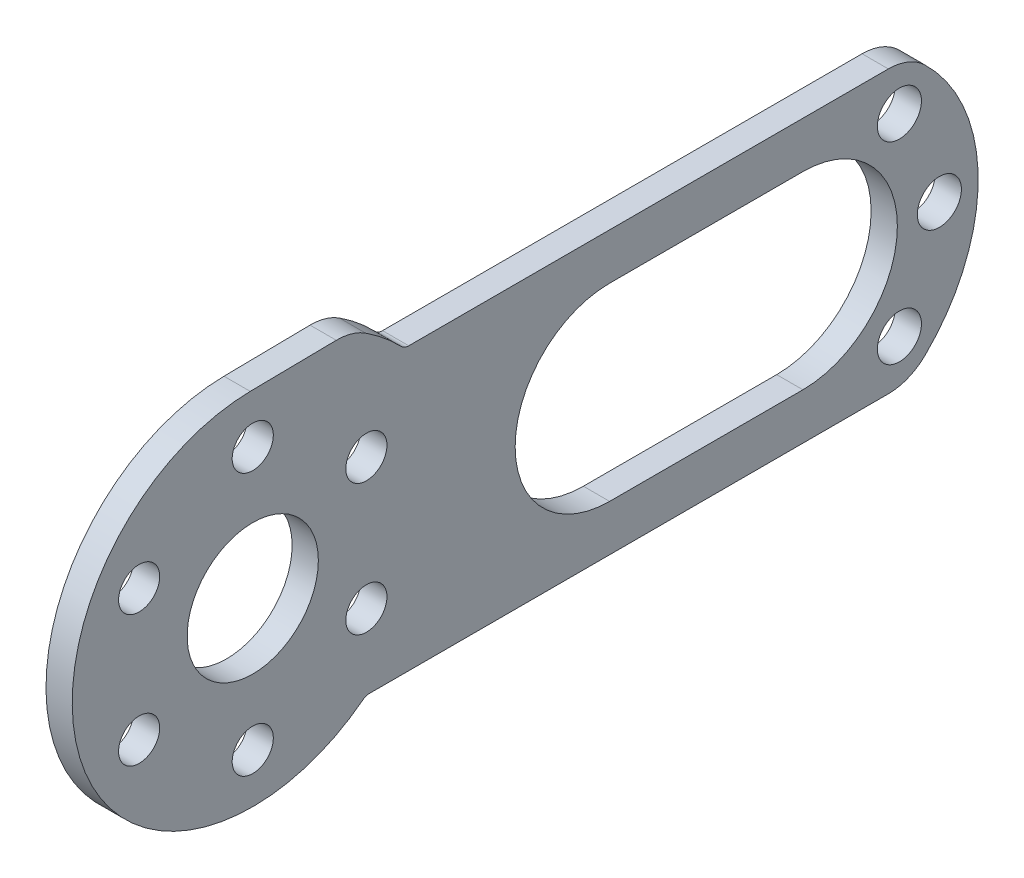
ISO-10303-21;
HEADER;
FILE_DESCRIPTION(('STEP AP214'),'2;1');
FILE_NAME('part.step','',(''),(''),'','','');
FILE_SCHEMA(('AUTOMOTIVE_DESIGN { 1 0 10303 214 1 1 1 1 }'));
ENDSEC;
DATA;
#1=APPLICATION_CONTEXT('core data for automotive mechanical design processes');
#2=APPLICATION_PROTOCOL_DEFINITION('international standard','automotive_design',2000,#1);
#3=PRODUCT_CONTEXT('',#1,'mechanical');
#4=PRODUCT('Part','Part','',(#3));
#5=PRODUCT_RELATED_PRODUCT_CATEGORY('part','',(#4));
#6=PRODUCT_DEFINITION_FORMATION('','',#4);
#7=PRODUCT_DEFINITION_CONTEXT('part definition',#1,'design');
#8=PRODUCT_DEFINITION('design','',#6,#7);
#9=PRODUCT_DEFINITION_SHAPE('','',#8);
#10=(LENGTH_UNIT() NAMED_UNIT(*) SI_UNIT(.MILLI.,.METRE.));
#11=(NAMED_UNIT(*) PLANE_ANGLE_UNIT() SI_UNIT($,.RADIAN.));
#12=(NAMED_UNIT(*) SI_UNIT($,.STERADIAN.) SOLID_ANGLE_UNIT());
#13=UNCERTAINTY_MEASURE_WITH_UNIT(LENGTH_MEASURE(1.E-05),#10,'distance_accuracy_value','');
#14=(GEOMETRIC_REPRESENTATION_CONTEXT(3) GLOBAL_UNCERTAINTY_ASSIGNED_CONTEXT((#13)) GLOBAL_UNIT_ASSIGNED_CONTEXT((#10,
#11,#12)) REPRESENTATION_CONTEXT('',''));
#15=CARTESIAN_POINT('',(0.,0.,0.));
#16=DIRECTION('',(0.,0.,1.));
#17=DIRECTION('',(1.,0.,0.));
#18=AXIS2_PLACEMENT_3D('',#15,#16,#17);
#19=CARTESIAN_POINT('',(-2.74319999999998,0.,0.));
#20=DIRECTION('',(1.,0.,0.));
#21=DIRECTION('',(0.,0.,-1.));
#22=AXIS2_PLACEMENT_3D('',#19,#20,#21);
#23=PLANE('',#22);
#24=CARTESIAN_POINT('',(-2.74319999999998,0.,0.));
#25=DIRECTION('',(1.,0.,0.));
#26=DIRECTION('',(0.,0.,-1.));
#27=AXIS2_PLACEMENT_3D('',#24,#25,#26);
#28=CIRCLE('',#27,7.9375);
#29=CARTESIAN_POINT('',(-2.74319999999998,0.,-7.9375));
#30=VERTEX_POINT('',#29);
#31=EDGE_CURVE('E253',#30,#30,#28,.T.);
#32=ORIENTED_EDGE('',*,*,#31,.T.);
#33=EDGE_LOOP('',(#32));
#34=FACE_BOUND('',#33,.T.);
#35=DIRECTION('',(0.,0.,-1.));
#36=VECTOR('',#35,1.);
#37=CARTESIAN_POINT('',(-2.74319999999998,-11.43,-43.18));
#38=LINE('',#37,#36);
#39=CARTESIAN_POINT('',(-2.74319999999998,-11.43,-43.18));
#40=VERTEX_POINT('',#39);
#41=CARTESIAN_POINT('',(-2.74319999999998,-11.43,-66.5674733333333));
#42=VERTEX_POINT('',#41);
#43=EDGE_CURVE('E231',#40,#42,#38,.T.);
#44=ORIENTED_EDGE('',*,*,#43,.T.);
#45=CARTESIAN_POINT('',(-2.74319999999998,0.,-66.5674733333333));
#46=DIRECTION('',(1.,0.,0.));
#47=DIRECTION('',(0.,0.,-1.));
#48=AXIS2_PLACEMENT_3D('',#45,#46,#47);
#49=CIRCLE('',#48,11.43);
#50=CARTESIAN_POINT('',(-2.74319999999998,11.43,-66.5674733333333));
#51=VERTEX_POINT('',#50);
#52=EDGE_CURVE('E221',#42,#51,#49,.T.);
#53=ORIENTED_EDGE('',*,*,#52,.T.);
#54=DIRECTION('',(0.,0.,1.));
#55=VECTOR('',#54,1.);
#56=CARTESIAN_POINT('',(-2.74319999999998,11.43,-66.5674733333333));
#57=LINE('',#56,#55);
#58=CARTESIAN_POINT('',(-2.74319999999998,11.43,-43.18));
#59=VERTEX_POINT('',#58);
#60=EDGE_CURVE('E224',#51,#59,#57,.T.);
#61=ORIENTED_EDGE('',*,*,#60,.T.);
#62=CARTESIAN_POINT('',(-2.74319999999998,0.,-43.18));
#63=DIRECTION('',(1.,0.,0.));
#64=DIRECTION('',(0.,0.,-1.));
#65=AXIS2_PLACEMENT_3D('',#62,#63,#64);
#66=CIRCLE('',#65,11.43);
#67=EDGE_CURVE('E228',#59,#40,#66,.T.);
#68=ORIENTED_EDGE('',*,*,#67,.T.);
#69=EDGE_LOOP('',(#44,#53,#61,#68));
#70=FACE_BOUND('',#69,.T.);
#71=CARTESIAN_POINT('',(-2.74319999999998,7.93750000000016,13.7481532850779));
#72=DIRECTION('',(1.,0.,0.));
#73=DIRECTION('',(0.,0.,-1.));
#74=AXIS2_PLACEMENT_3D('',#71,#72,#73);
#75=CIRCLE('',#74,2.4892);
#76=CARTESIAN_POINT('',(-2.74319999999998,7.93750000000016,11.2589532850779));
#77=VERTEX_POINT('',#76);
#78=EDGE_CURVE('E215',#77,#77,#75,.T.);
#79=ORIENTED_EDGE('',*,*,#78,.T.);
#80=EDGE_LOOP('',(#79));
#81=FACE_BOUND('',#80,.T.);
#82=CARTESIAN_POINT('',(-2.74319999999998,-7.93749999999987,13.748153285078));
#83=DIRECTION('',(1.,0.,0.));
#84=DIRECTION('',(0.,0.,-1.));
#85=AXIS2_PLACEMENT_3D('',#82,#83,#84);
#86=CIRCLE('',#85,2.4892);
#87=CARTESIAN_POINT('',(-2.74319999999998,-7.93749999999987,11.258953285078));
#88=VERTEX_POINT('',#87);
#89=EDGE_CURVE('E209',#88,#88,#86,.T.);
#90=ORIENTED_EDGE('',*,*,#89,.T.);
#91=EDGE_LOOP('',(#90));
#92=FACE_BOUND('',#91,.T.);
#93=CARTESIAN_POINT('',(-2.74319999999998,-15.875,0.));
#94=DIRECTION('',(1.,0.,0.));
#95=DIRECTION('',(0.,0.,-1.));
#96=AXIS2_PLACEMENT_3D('',#93,#94,#95);
#97=CIRCLE('',#96,2.4892);
#98=CARTESIAN_POINT('',(-2.74319999999998,-15.875,-2.4892));
#99=VERTEX_POINT('',#98);
#100=EDGE_CURVE('E203',#99,#99,#97,.T.);
#101=ORIENTED_EDGE('',*,*,#100,.T.);
#102=EDGE_LOOP('',(#101));
#103=FACE_BOUND('',#102,.T.);
#104=CARTESIAN_POINT('',(-2.74319999999998,-7.93750000000007,-13.7481532850779));
#105=DIRECTION('',(1.,0.,0.));
#106=DIRECTION('',(0.,0.,-1.));
#107=AXIS2_PLACEMENT_3D('',#104,#105,#106);
#108=CIRCLE('',#107,2.4892);
#109=CARTESIAN_POINT('',(-2.74319999999998,-7.93750000000007,-16.2373532850779));
#110=VERTEX_POINT('',#109);
#111=EDGE_CURVE('E197',#110,#110,#108,.T.);
#112=ORIENTED_EDGE('',*,*,#111,.T.);
#113=EDGE_LOOP('',(#112));
#114=FACE_BOUND('',#113,.T.);
#115=CARTESIAN_POINT('',(-2.74319999999998,7.93749999999997,-13.748153285078));
#116=DIRECTION('',(1.,0.,0.));
#117=DIRECTION('',(0.,0.,-1.));
#118=AXIS2_PLACEMENT_3D('',#115,#116,#117);
#119=CIRCLE('',#118,2.4892);
#120=CARTESIAN_POINT('',(-2.74319999999998,7.93749999999997,-16.237353285078));
#121=VERTEX_POINT('',#120);
#122=EDGE_CURVE('E191',#121,#121,#119,.T.);
#123=ORIENTED_EDGE('',*,*,#122,.T.);
#124=EDGE_LOOP('',(#123));
#125=FACE_BOUND('',#124,.T.);
#126=CARTESIAN_POINT('',(-2.74319999999998,15.875,0.));
#127=DIRECTION('',(1.,0.,0.));
#128=DIRECTION('',(0.,0.,-1.));
#129=AXIS2_PLACEMENT_3D('',#126,#127,#128);
#130=CIRCLE('',#129,2.4892);
#131=CARTESIAN_POINT('',(-2.74319999999998,15.875,-2.4892));
#132=VERTEX_POINT('',#131);
#133=EDGE_CURVE('E183',#132,#132,#130,.T.);
#134=ORIENTED_EDGE('',*,*,#133,.T.);
#135=EDGE_LOOP('',(#134));
#136=FACE_BOUND('',#135,.T.);
#137=CARTESIAN_POINT('',(-2.74319999999998,11.6743329573899,-78.2418062907232));
#138=DIRECTION('',(-1.,0.,0.));
#139=DIRECTION('',(0.,0.,1.));
#140=AXIS2_PLACEMENT_3D('',#137,#138,#139);
#141=CIRCLE('',#140,2.667);
#142=CARTESIAN_POINT('',(-2.74319999999998,11.6743329573899,-75.5748062907232));
#143=VERTEX_POINT('',#142);
#144=EDGE_CURVE('E154',#143,#143,#141,.T.);
#145=ORIENTED_EDGE('',*,*,#144,.F.);
#146=EDGE_LOOP('',(#145));
#147=FACE_BOUND('',#146,.T.);
#148=CARTESIAN_POINT('',(-2.74319999999998,0.,-83.0774733333333));
#149=DIRECTION('',(-1.,0.,0.));
#150=DIRECTION('',(0.,0.,1.));
#151=AXIS2_PLACEMENT_3D('',#148,#149,#150);
#152=CIRCLE('',#151,2.667);
#153=CARTESIAN_POINT('',(-2.74319999999998,0.,-80.4104733333333));
#154=VERTEX_POINT('',#153);
#155=EDGE_CURVE('E178',#154,#154,#152,.T.);
#156=ORIENTED_EDGE('',*,*,#155,.F.);
#157=EDGE_LOOP('',(#156));
#158=FACE_BOUND('',#157,.T.);
#159=CARTESIAN_POINT('',(-2.74319999999998,-11.6743329573899,-78.2418062907232));
#160=DIRECTION('',(-1.,0.,0.));
#161=DIRECTION('',(0.,0.,1.));
#162=AXIS2_PLACEMENT_3D('',#159,#160,#161);
#163=CIRCLE('',#162,2.66699999999998);
#164=CARTESIAN_POINT('',(-2.74319999999998,-11.6743329573899,-75.5748062907232));
#165=VERTEX_POINT('',#164);
#166=EDGE_CURVE('E174',#165,#165,#163,.T.);
#167=ORIENTED_EDGE('',*,*,#166,.F.);
#168=EDGE_LOOP('',(#167));
#169=FACE_BOUND('',#168,.T.);
#170=DIRECTION('',(0.,0.0140650141212733,-0.999901082796578));
#171=VECTOR('',#170,1.);
#172=CARTESIAN_POINT('',(-2.74319999999998,21.8418392526084,0.307236168465115));
#173=LINE('',#172,#171);
#174=CARTESIAN_POINT('',(-2.74319999999998,21.8418392526084,0.307236168465115));
#175=VERTEX_POINT('',#174);
#176=CARTESIAN_POINT('',(-2.74319999999998,21.9883232010722,-10.1065079926348));
#177=VERTEX_POINT('',#176);
#178=EDGE_CURVE('E145',#175,#177,#173,.T.);
#179=ORIENTED_EDGE('',*,*,#178,.T.);
#180=CARTESIAN_POINT('',(-2.74319999999998,15.6389513253139,-10.1958208323049));
#181=DIRECTION('',(1.,0.,0.));
#182=DIRECTION('',(0.,0.,-1.));
#183=AXIS2_PLACEMENT_3D('',#180,#181,#182);
#184=CIRCLE('',#183,6.35);
#185=CARTESIAN_POINT('',(-2.74319999999998,20.9583225244003,-13.6637871017964));
#186=VERTEX_POINT('',#185);
#187=EDGE_CURVE('E270',#177,#186,#184,.F.);
#188=ORIENTED_EDGE('',*,*,#187,.T.);
#189=CARTESIAN_POINT('',(-2.74319999999998,0.,0.));
#190=DIRECTION('',(-1.,0.,0.));
#191=DIRECTION('',(0.,0.,1.));
#192=AXIS2_PLACEMENT_3D('',#189,#190,#191);
#193=CIRCLE('',#192,25.019);
#194=CARTESIAN_POINT('',(-2.74319999999998,17.412031008346,-17.9658436251793));
#195=VERTEX_POINT('',#194);
#196=EDGE_CURVE('E161',#186,#195,#193,.T.);
#197=ORIENTED_EDGE('',*,*,#196,.T.);
#198=CARTESIAN_POINT('',(-2.74319999999998,18.295890450394,-18.8778153828027));
#199=DIRECTION('',(1.,0.,0.));
#200=DIRECTION('',(0.,0.,-1.));
#201=AXIS2_PLACEMENT_3D('',#198,#199,#200);
#202=CIRCLE('',#201,1.27);
#203=CARTESIAN_POINT('',(-2.74319999999998,17.025890450394,-18.8778153828027));
#204=VERTEX_POINT('',#203);
#205=EDGE_CURVE('E300',#195,#204,#202,.T.);
#206=ORIENTED_EDGE('',*,*,#205,.T.);
#207=DIRECTION('',(0.,0.,-1.));
#208=VECTOR('',#207,1.);
#209=CARTESIAN_POINT('',(-2.74319999999998,17.025890450394,-18.3321961415206));
#210=LINE('',#209,#208);
#211=CARTESIAN_POINT('',(-2.74319999999998,17.025890450394,-76.9026193938003));
#212=VERTEX_POINT('',#211);
#213=EDGE_CURVE('E164',#204,#212,#210,.T.);
#214=ORIENTED_EDGE('',*,*,#213,.T.);
#215=CARTESIAN_POINT('',(-2.74319999999998,10.675890450394,-76.9026193938003));
#216=DIRECTION('',(1.,0.,0.));
#217=DIRECTION('',(0.,0.,-1.));
#218=AXIS2_PLACEMENT_3D('',#215,#216,#217);
#219=CIRCLE('',#218,6.35);
#220=CARTESIAN_POINT('',(-2.74319999999998,15.2382367967162,-81.3193484794699));
#221=VERTEX_POINT('',#220);
#222=EDGE_CURVE('E268',#212,#221,#219,.F.);
#223=ORIENTED_EDGE('',*,*,#222,.T.);
#224=CARTESIAN_POINT('',(-2.74319999999998,0.,-66.5674733333333));
#225=DIRECTION('',(-1.,0.,0.));
#226=DIRECTION('',(0.,0.,1.));
#227=AXIS2_PLACEMENT_3D('',#224,#225,#226);
#228=CIRCLE('',#227,21.209);
#229=CARTESIAN_POINT('',(-2.74319999999998,-15.2382367967163,-81.3193484794699));
#230=VERTEX_POINT('',#229);
#231=EDGE_CURVE('E169',#221,#230,#228,.T.);
#232=ORIENTED_EDGE('',*,*,#231,.T.);
#233=CARTESIAN_POINT('',(-2.74319999999998,-10.675890450394,-76.9026193938003));
#234=DIRECTION('',(1.,0.,0.));
#235=DIRECTION('',(0.,0.,-1.));
#236=AXIS2_PLACEMENT_3D('',#233,#234,#235);
#237=CIRCLE('',#236,6.35);
#238=CARTESIAN_POINT('',(-2.74319999999998,-17.025890450394,-76.9026193938003));
#239=VERTEX_POINT('',#238);
#240=EDGE_CURVE('E266',#230,#239,#237,.F.);
#241=ORIENTED_EDGE('',*,*,#240,.T.);
#242=DIRECTION('',(0.,0.,1.));
#243=VECTOR('',#242,1.);
#244=CARTESIAN_POINT('',(-2.74319999999998,-17.025890450394,-79.214241116889));
#245=LINE('',#244,#243);
#246=CARTESIAN_POINT('',(-2.74319999999998,-17.025890450394,-14.1250624291428));
#247=VERTEX_POINT('',#246);
#248=EDGE_CURVE('E172',#239,#247,#245,.T.);
#249=ORIENTED_EDGE('',*,*,#248,.T.);
#250=CARTESIAN_POINT('',(-2.74319999999998,-18.295890450394,-14.1250624291428));
#251=DIRECTION('',(1.,0.,0.));
#252=DIRECTION('',(0.,0.,-1.));
#253=AXIS2_PLACEMENT_3D('',#250,#251,#252);
#254=CIRCLE('',#253,1.27);
#255=CARTESIAN_POINT('',(-2.74319999999998,-17.2906217443284,-13.3489600978712));
#256=VERTEX_POINT('',#255);
#257=EDGE_CURVE('E47',#247,#256,#254,.T.);
#258=ORIENTED_EDGE('',*,*,#257,.T.);
#259=CARTESIAN_POINT('',(-2.74319999999998,0.,0.));
#260=DIRECTION('',(-1.,0.,0.));
#261=DIRECTION('',(0.,0.,1.));
#262=AXIS2_PLACEMENT_3D('',#259,#260,#261);
#263=CIRCLE('',#262,21.844);
#264=EDGE_CURVE('E142',#256,#175,#263,.T.);
#265=ORIENTED_EDGE('',*,*,#264,.T.);
#266=EDGE_LOOP('',(#179,#188,#197,#206,#214,#223,#232,#241,#249,#258,#265));
#267=FACE_BOUND('',#266,.T.);
#268=ADVANCED_FACE('F39',(#34,#70,#81,#92,#103,#114,#125,#136,#147,#158,#169,#267),#23,.F.);
#269=CARTESIAN_POINT('',(0.431800000000019,0.,0.));
#270=DIRECTION('',(1.,0.,0.));
#271=DIRECTION('',(0.,0.,-1.));
#272=AXIS2_PLACEMENT_3D('',#269,#270,#271);
#273=PLANE('',#272);
#274=CARTESIAN_POINT('',(0.431800000000019,0.,0.));
#275=DIRECTION('',(1.,0.,0.));
#276=DIRECTION('',(0.,0.,-1.));
#277=AXIS2_PLACEMENT_3D('',#274,#275,#276);
#278=CIRCLE('',#277,7.9375);
#279=CARTESIAN_POINT('',(0.431800000000019,0.,-7.9375));
#280=VERTEX_POINT('',#279);
#281=EDGE_CURVE('E246',#280,#280,#278,.T.);
#282=ORIENTED_EDGE('',*,*,#281,.F.);
#283=EDGE_LOOP('',(#282));
#284=FACE_BOUND('',#283,.T.);
#285=CARTESIAN_POINT('',(0.431800000000019,0.,-66.5674733333333));
#286=DIRECTION('',(1.,0.,0.));
#287=DIRECTION('',(0.,0.,-1.));
#288=AXIS2_PLACEMENT_3D('',#285,#286,#287);
#289=CIRCLE('',#288,11.43);
#290=CARTESIAN_POINT('',(0.431800000000019,-11.43,-66.5674733333333));
#291=VERTEX_POINT('',#290);
#292=CARTESIAN_POINT('',(0.431800000000019,11.43,-66.5674733333333));
#293=VERTEX_POINT('',#292);
#294=EDGE_CURVE('E218',#291,#293,#289,.T.);
#295=ORIENTED_EDGE('',*,*,#294,.F.);
#296=DIRECTION('',(0.,0.,-1.));
#297=VECTOR('',#296,1.);
#298=CARTESIAN_POINT('',(0.431800000000019,-11.43,-43.18));
#299=LINE('',#298,#297);
#300=CARTESIAN_POINT('',(0.431800000000019,-11.43,-43.18));
#301=VERTEX_POINT('',#300);
#302=EDGE_CURVE('E225',#301,#291,#299,.T.);
#303=ORIENTED_EDGE('',*,*,#302,.F.);
#304=CARTESIAN_POINT('',(0.431800000000019,0.,-43.18));
#305=DIRECTION('',(1.,0.,0.));
#306=DIRECTION('',(0.,0.,-1.));
#307=AXIS2_PLACEMENT_3D('',#304,#305,#306);
#308=CIRCLE('',#307,11.43);
#309=CARTESIAN_POINT('',(0.431800000000019,11.43,-43.18));
#310=VERTEX_POINT('',#309);
#311=EDGE_CURVE('E239',#310,#301,#308,.T.);
#312=ORIENTED_EDGE('',*,*,#311,.F.);
#313=DIRECTION('',(0.,0.,1.));
#314=VECTOR('',#313,1.);
#315=CARTESIAN_POINT('',(0.431800000000019,11.43,-66.5674733333333));
#316=LINE('',#315,#314);
#317=EDGE_CURVE('E236',#293,#310,#316,.T.);
#318=ORIENTED_EDGE('',*,*,#317,.F.);
#319=EDGE_LOOP('',(#295,#303,#312,#318));
#320=FACE_BOUND('',#319,.T.);
#321=CARTESIAN_POINT('',(0.431800000000019,7.93750000000016,13.7481532850779));
#322=DIRECTION('',(1.,0.,0.));
#323=DIRECTION('',(0.,0.,-1.));
#324=AXIS2_PLACEMENT_3D('',#321,#322,#323);
#325=CIRCLE('',#324,2.4892);
#326=CARTESIAN_POINT('',(0.431800000000019,7.93750000000016,11.2589532850779));
#327=VERTEX_POINT('',#326);
#328=EDGE_CURVE('E212',#327,#327,#325,.T.);
#329=ORIENTED_EDGE('',*,*,#328,.F.);
#330=EDGE_LOOP('',(#329));
#331=FACE_BOUND('',#330,.T.);
#332=CARTESIAN_POINT('',(0.431800000000019,-7.93749999999987,13.748153285078));
#333=DIRECTION('',(1.,0.,0.));
#334=DIRECTION('',(0.,0.,-1.));
#335=AXIS2_PLACEMENT_3D('',#332,#333,#334);
#336=CIRCLE('',#335,2.4892);
#337=CARTESIAN_POINT('',(0.431800000000019,-7.93749999999987,11.258953285078));
#338=VERTEX_POINT('',#337);
#339=EDGE_CURVE('E206',#338,#338,#336,.T.);
#340=ORIENTED_EDGE('',*,*,#339,.F.);
#341=EDGE_LOOP('',(#340));
#342=FACE_BOUND('',#341,.T.);
#343=CARTESIAN_POINT('',(0.431800000000019,-15.875,0.));
#344=DIRECTION('',(1.,0.,0.));
#345=DIRECTION('',(0.,0.,-1.));
#346=AXIS2_PLACEMENT_3D('',#343,#344,#345);
#347=CIRCLE('',#346,2.4892);
#348=CARTESIAN_POINT('',(0.431800000000019,-15.875,-2.4892));
#349=VERTEX_POINT('',#348);
#350=EDGE_CURVE('E200',#349,#349,#347,.T.);
#351=ORIENTED_EDGE('',*,*,#350,.F.);
#352=EDGE_LOOP('',(#351));
#353=FACE_BOUND('',#352,.T.);
#354=CARTESIAN_POINT('',(0.431800000000019,-7.93750000000007,-13.7481532850779));
#355=DIRECTION('',(1.,0.,0.));
#356=DIRECTION('',(0.,0.,-1.));
#357=AXIS2_PLACEMENT_3D('',#354,#355,#356);
#358=CIRCLE('',#357,2.4892);
#359=CARTESIAN_POINT('',(0.431800000000019,-7.93750000000007,-16.2373532850779));
#360=VERTEX_POINT('',#359);
#361=EDGE_CURVE('E194',#360,#360,#358,.T.);
#362=ORIENTED_EDGE('',*,*,#361,.F.);
#363=EDGE_LOOP('',(#362));
#364=FACE_BOUND('',#363,.T.);
#365=CARTESIAN_POINT('',(0.431800000000019,7.93749999999997,-13.748153285078));
#366=DIRECTION('',(1.,0.,0.));
#367=DIRECTION('',(0.,0.,-1.));
#368=AXIS2_PLACEMENT_3D('',#365,#366,#367);
#369=CIRCLE('',#368,2.4892);
#370=CARTESIAN_POINT('',(0.431800000000019,7.93749999999997,-16.237353285078));
#371=VERTEX_POINT('',#370);
#372=EDGE_CURVE('E186',#371,#371,#369,.T.);
#373=ORIENTED_EDGE('',*,*,#372,.F.);
#374=EDGE_LOOP('',(#373));
#375=FACE_BOUND('',#374,.T.);
#376=CARTESIAN_POINT('',(0.431800000000019,15.875,0.));
#377=DIRECTION('',(1.,0.,0.));
#378=DIRECTION('',(0.,0.,-1.));
#379=AXIS2_PLACEMENT_3D('',#376,#377,#378);
#380=CIRCLE('',#379,2.4892);
#381=CARTESIAN_POINT('',(0.431800000000019,15.875,-2.4892));
#382=VERTEX_POINT('',#381);
#383=EDGE_CURVE('E187',#382,#382,#380,.T.);
#384=ORIENTED_EDGE('',*,*,#383,.F.);
#385=EDGE_LOOP('',(#384));
#386=FACE_BOUND('',#385,.T.);
#387=CARTESIAN_POINT('',(0.431800000000017,11.6743329573899,-78.2418062907232));
#388=DIRECTION('',(1.,0.,0.));
#389=DIRECTION('',(0.,0.,-1.));
#390=AXIS2_PLACEMENT_3D('',#387,#388,#389);
#391=CIRCLE('',#390,2.667);
#392=CARTESIAN_POINT('',(0.431800000000017,11.6743329573899,-80.9088062907232));
#393=VERTEX_POINT('',#392);
#394=EDGE_CURVE('E177',#393,#393,#391,.T.);
#395=ORIENTED_EDGE('',*,*,#394,.F.);
#396=EDGE_LOOP('',(#395));
#397=FACE_BOUND('',#396,.T.);
#398=CARTESIAN_POINT('',(0.431800000000017,0.,-83.0774733333333));
#399=DIRECTION('',(1.,0.,0.));
#400=DIRECTION('',(0.,0.,-1.));
#401=AXIS2_PLACEMENT_3D('',#398,#399,#400);
#402=CIRCLE('',#401,2.667);
#403=CARTESIAN_POINT('',(0.431800000000017,0.,-85.7444733333333));
#404=VERTEX_POINT('',#403);
#405=EDGE_CURVE('E260',#404,#404,#402,.T.);
#406=ORIENTED_EDGE('',*,*,#405,.F.);
#407=EDGE_LOOP('',(#406));
#408=FACE_BOUND('',#407,.T.);
#409=CARTESIAN_POINT('',(0.431800000000017,-11.6743329573899,-78.2418062907232));
#410=DIRECTION('',(1.,0.,0.));
#411=DIRECTION('',(0.,0.,-1.));
#412=AXIS2_PLACEMENT_3D('',#409,#410,#411);
#413=CIRCLE('',#412,2.66699999999998);
#414=CARTESIAN_POINT('',(0.431800000000017,-11.6743329573899,-80.9088062907231));
#415=VERTEX_POINT('',#414);
#416=EDGE_CURVE('E190',#415,#415,#413,.T.);
#417=ORIENTED_EDGE('',*,*,#416,.F.);
#418=EDGE_LOOP('',(#417));
#419=FACE_BOUND('',#418,.T.);
#420=CARTESIAN_POINT('',(0.431800000000019,0.,0.));
#421=DIRECTION('',(-1.,0.,0.));
#422=DIRECTION('',(0.,0.,1.));
#423=AXIS2_PLACEMENT_3D('',#420,#421,#422);
#424=CIRCLE('',#423,25.019);
#425=CARTESIAN_POINT('',(0.431800000000019,20.9583225244003,-13.6637871017964));
#426=VERTEX_POINT('',#425);
#427=CARTESIAN_POINT('',(0.431800000000019,17.412031008346,-17.9658436251793));
#428=VERTEX_POINT('',#427);
#429=EDGE_CURVE('E309',#426,#428,#424,.T.);
#430=ORIENTED_EDGE('',*,*,#429,.F.);
#431=CARTESIAN_POINT('',(0.431800000000019,15.6389513253139,-10.1958208323049));
#432=DIRECTION('',(1.,0.,0.));
#433=DIRECTION('',(0.,0.,-1.));
#434=AXIS2_PLACEMENT_3D('',#431,#432,#433);
#435=CIRCLE('',#434,6.35);
#436=CARTESIAN_POINT('',(0.431800000000019,21.9883232010722,-10.1065079926348));
#437=VERTEX_POINT('',#436);
#438=EDGE_CURVE('E279',#426,#437,#435,.T.);
#439=ORIENTED_EDGE('',*,*,#438,.T.);
#440=DIRECTION('',(0.,0.0140650141212733,-0.999901082796578));
#441=VECTOR('',#440,1.);
#442=CARTESIAN_POINT('',(0.431800000000019,21.8418392526084,0.307236168465115));
#443=LINE('',#442,#441);
#444=CARTESIAN_POINT('',(0.431800000000019,21.8418392526084,0.307236168465115));
#445=VERTEX_POINT('',#444);
#446=EDGE_CURVE('E319',#445,#437,#443,.T.);
#447=ORIENTED_EDGE('',*,*,#446,.F.);
#448=CARTESIAN_POINT('',(0.431800000000019,0.,0.));
#449=DIRECTION('',(-1.,0.,0.));
#450=DIRECTION('',(0.,0.,1.));
#451=AXIS2_PLACEMENT_3D('',#448,#449,#450);
#452=CIRCLE('',#451,21.844);
#453=CARTESIAN_POINT('',(0.431800000000019,-17.2906217443284,-13.3489600978712));
#454=VERTEX_POINT('',#453);
#455=EDGE_CURVE('E150',#454,#445,#452,.T.);
#456=ORIENTED_EDGE('',*,*,#455,.F.);
#457=CARTESIAN_POINT('',(0.431800000000019,-18.295890450394,-14.1250624291428));
#458=DIRECTION('',(1.,0.,0.));
#459=DIRECTION('',(0.,0.,-1.));
#460=AXIS2_PLACEMENT_3D('',#457,#458,#459);
#461=CIRCLE('',#460,1.27);
#462=CARTESIAN_POINT('',(0.431800000000019,-17.025890450394,-14.1250624291428));
#463=VERTEX_POINT('',#462);
#464=EDGE_CURVE('E11',#454,#463,#461,.F.);
#465=ORIENTED_EDGE('',*,*,#464,.T.);
#466=DIRECTION('',(0.,0.,1.));
#467=VECTOR('',#466,1.);
#468=CARTESIAN_POINT('',(0.431800000000019,-17.025890450394,-79.214241116889));
#469=LINE('',#468,#467);
#470=CARTESIAN_POINT('',(0.431800000000019,-17.025890450394,-76.9026193938003));
#471=VERTEX_POINT('',#470);
#472=EDGE_CURVE('E155',#471,#463,#469,.T.);
#473=ORIENTED_EDGE('',*,*,#472,.F.);
#474=CARTESIAN_POINT('',(0.431800000000019,-10.675890450394,-76.9026193938003));
#475=DIRECTION('',(1.,0.,0.));
#476=DIRECTION('',(0.,0.,-1.));
#477=AXIS2_PLACEMENT_3D('',#474,#475,#476);
#478=CIRCLE('',#477,6.35);
#479=CARTESIAN_POINT('',(0.431800000000019,-15.2382367967163,-81.3193484794699));
#480=VERTEX_POINT('',#479);
#481=EDGE_CURVE('E274',#471,#480,#478,.T.);
#482=ORIENTED_EDGE('',*,*,#481,.T.);
#483=CARTESIAN_POINT('',(0.431800000000019,0.,-66.5674733333333));
#484=DIRECTION('',(-1.,0.,0.));
#485=DIRECTION('',(0.,0.,1.));
#486=AXIS2_PLACEMENT_3D('',#483,#484,#485);
#487=CIRCLE('',#486,21.209);
#488=CARTESIAN_POINT('',(0.431800000000019,15.2382367967162,-81.3193484794699));
#489=VERTEX_POINT('',#488);
#490=EDGE_CURVE('E337',#489,#480,#487,.T.);
#491=ORIENTED_EDGE('',*,*,#490,.F.);
#492=CARTESIAN_POINT('',(0.431800000000019,10.675890450394,-76.9026193938003));
#493=DIRECTION('',(1.,0.,0.));
#494=DIRECTION('',(0.,0.,-1.));
#495=AXIS2_PLACEMENT_3D('',#492,#493,#494);
#496=CIRCLE('',#495,6.35);
#497=CARTESIAN_POINT('',(0.431800000000019,17.025890450394,-76.9026193938003));
#498=VERTEX_POINT('',#497);
#499=EDGE_CURVE('E276',#489,#498,#496,.T.);
#500=ORIENTED_EDGE('',*,*,#499,.T.);
#501=DIRECTION('',(0.,0.,-1.));
#502=VECTOR('',#501,1.);
#503=CARTESIAN_POINT('',(0.431800000000019,17.025890450394,-18.3321961415206));
#504=LINE('',#503,#502);
#505=CARTESIAN_POINT('',(0.431800000000019,17.025890450394,-18.8778153828027));
#506=VERTEX_POINT('',#505);
#507=EDGE_CURVE('E311',#506,#498,#504,.T.);
#508=ORIENTED_EDGE('',*,*,#507,.F.);
#509=CARTESIAN_POINT('',(0.431800000000019,18.295890450394,-18.8778153828027));
#510=DIRECTION('',(1.,0.,0.));
#511=DIRECTION('',(0.,0.,-1.));
#512=AXIS2_PLACEMENT_3D('',#509,#510,#511);
#513=CIRCLE('',#512,1.27);
#514=EDGE_CURVE('E302',#506,#428,#513,.F.);
#515=ORIENTED_EDGE('',*,*,#514,.T.);
#516=EDGE_LOOP('',(#430,#439,#447,#456,#465,#473,#482,#491,#500,#508,#515));
#517=FACE_BOUND('',#516,.T.);
#518=ADVANCED_FACE('F308',(#284,#320,#331,#342,#353,#364,#375,#386,#397,#408,#419,#517),#273,.T.);
#519=CARTESIAN_POINT('',(-2.74319999999998,0.,0.));
#520=DIRECTION('',(1.,0.,0.));
#521=DIRECTION('',(0.,0.,-1.));
#522=AXIS2_PLACEMENT_3D('',#519,#520,#521);
#523=CYLINDRICAL_SURFACE('',#522,7.9375);
#524=ORIENTED_EDGE('',*,*,#31,.F.);
#525=EDGE_LOOP('',(#524));
#526=FACE_BOUND('',#525,.T.);
#527=ORIENTED_EDGE('',*,*,#281,.T.);
#528=EDGE_LOOP('',(#527));
#529=FACE_BOUND('',#528,.T.);
#530=ADVANCED_FACE('F371',(#526,#529),#523,.F.);
#531=CARTESIAN_POINT('',(-2.74319999999998,0.,-66.5674733333333));
#532=DIRECTION('',(1.,0.,0.));
#533=DIRECTION('',(0.,0.,-1.));
#534=AXIS2_PLACEMENT_3D('',#531,#532,#533);
#535=CYLINDRICAL_SURFACE('',#534,11.43);
#536=ORIENTED_EDGE('',*,*,#294,.T.);
#537=DIRECTION('',(1.,0.,0.));
#538=VECTOR('',#537,1.);
#539=CARTESIAN_POINT('',(-2.74319999999998,11.43,-66.5674733333333));
#540=LINE('',#539,#538);
#541=EDGE_CURVE('E234',#51,#293,#540,.T.);
#542=ORIENTED_EDGE('',*,*,#541,.F.);
#543=ORIENTED_EDGE('',*,*,#52,.F.);
#544=DIRECTION('',(1.,0.,0.));
#545=VECTOR('',#544,1.);
#546=CARTESIAN_POINT('',(-2.74319999999998,-11.43,-66.5674733333333));
#547=LINE('',#546,#545);
#548=EDGE_CURVE('E244',#42,#291,#547,.T.);
#549=ORIENTED_EDGE('',*,*,#548,.T.);
#550=EDGE_LOOP('',(#536,#542,#543,#549));
#551=FACE_BOUND('',#550,.T.);
#552=ADVANCED_FACE('F377',(#551),#535,.F.);
#553=CARTESIAN_POINT('',(-2.74319999999998,-11.43,-43.18));
#554=DIRECTION('',(0.,-1.,0.));
#555=DIRECTION('',(0.,0.,-1.));
#556=AXIS2_PLACEMENT_3D('',#553,#554,#555);
#557=PLANE('',#556);
#558=ORIENTED_EDGE('',*,*,#302,.T.);
#559=ORIENTED_EDGE('',*,*,#548,.F.);
#560=ORIENTED_EDGE('',*,*,#43,.F.);
#561=DIRECTION('',(1.,0.,0.));
#562=VECTOR('',#561,1.);
#563=CARTESIAN_POINT('',(-2.74319999999998,-11.43,-43.18));
#564=LINE('',#563,#562);
#565=EDGE_CURVE('E247',#40,#301,#564,.T.);
#566=ORIENTED_EDGE('',*,*,#565,.T.);
#567=EDGE_LOOP('',(#558,#559,#560,#566));
#568=FACE_BOUND('',#567,.T.);
#569=ADVANCED_FACE('F381',(#568),#557,.F.);
#570=CARTESIAN_POINT('',(-2.74319999999998,0.,-43.18));
#571=DIRECTION('',(1.,0.,0.));
#572=DIRECTION('',(0.,0.,-1.));
#573=AXIS2_PLACEMENT_3D('',#570,#571,#572);
#574=CYLINDRICAL_SURFACE('',#573,11.43);
#575=ORIENTED_EDGE('',*,*,#311,.T.);
#576=ORIENTED_EDGE('',*,*,#565,.F.);
#577=ORIENTED_EDGE('',*,*,#67,.F.);
#578=DIRECTION('',(1.,0.,0.));
#579=VECTOR('',#578,1.);
#580=CARTESIAN_POINT('',(-2.74319999999998,11.43,-43.18));
#581=LINE('',#580,#579);
#582=EDGE_CURVE('E249',#59,#310,#581,.T.);
#583=ORIENTED_EDGE('',*,*,#582,.T.);
#584=EDGE_LOOP('',(#575,#576,#577,#583));
#585=FACE_BOUND('',#584,.T.);
#586=ADVANCED_FACE('F387',(#585),#574,.F.);
#587=CARTESIAN_POINT('',(-2.74319999999998,11.43,-66.5674733333333));
#588=DIRECTION('',(0.,1.,0.));
#589=DIRECTION('',(0.,0.,1.));
#590=AXIS2_PLACEMENT_3D('',#587,#588,#589);
#591=PLANE('',#590);
#592=ORIENTED_EDGE('',*,*,#317,.T.);
#593=ORIENTED_EDGE('',*,*,#582,.F.);
#594=ORIENTED_EDGE('',*,*,#60,.F.);
#595=ORIENTED_EDGE('',*,*,#541,.T.);
#596=EDGE_LOOP('',(#592,#593,#594,#595));
#597=FACE_BOUND('',#596,.T.);
#598=ADVANCED_FACE('F383',(#597),#591,.F.);
#599=CARTESIAN_POINT('',(-2.74319999999998,7.93750000000016,13.7481532850779));
#600=DIRECTION('',(1.,0.,0.));
#601=DIRECTION('',(0.,0.,-1.));
#602=AXIS2_PLACEMENT_3D('',#599,#600,#601);
#603=CYLINDRICAL_SURFACE('',#602,2.4892);
#604=ORIENTED_EDGE('',*,*,#78,.F.);
#605=EDGE_LOOP('',(#604));
#606=FACE_BOUND('',#605,.T.);
#607=ORIENTED_EDGE('',*,*,#328,.T.);
#608=EDGE_LOOP('',(#607));
#609=FACE_BOUND('',#608,.T.);
#610=ADVANCED_FACE('F386',(#606,#609),#603,.F.);
#611=CARTESIAN_POINT('',(-2.74319999999998,-7.93749999999987,13.748153285078));
#612=DIRECTION('',(1.,0.,0.));
#613=DIRECTION('',(0.,0.,-1.));
#614=AXIS2_PLACEMENT_3D('',#611,#612,#613);
#615=CYLINDRICAL_SURFACE('',#614,2.4892);
#616=ORIENTED_EDGE('',*,*,#89,.F.);
#617=EDGE_LOOP('',(#616));
#618=FACE_BOUND('',#617,.T.);
#619=ORIENTED_EDGE('',*,*,#339,.T.);
#620=EDGE_LOOP('',(#619));
#621=FACE_BOUND('',#620,.T.);
#622=ADVANCED_FACE('F397',(#618,#621),#615,.F.);
#623=CARTESIAN_POINT('',(-2.74319999999998,-15.875,0.));
#624=DIRECTION('',(1.,0.,0.));
#625=DIRECTION('',(0.,0.,-1.));
#626=AXIS2_PLACEMENT_3D('',#623,#624,#625);
#627=CYLINDRICAL_SURFACE('',#626,2.4892);
#628=ORIENTED_EDGE('',*,*,#100,.F.);
#629=EDGE_LOOP('',(#628));
#630=FACE_BOUND('',#629,.T.);
#631=ORIENTED_EDGE('',*,*,#350,.T.);
#632=EDGE_LOOP('',(#631));
#633=FACE_BOUND('',#632,.T.);
#634=ADVANCED_FACE('F401',(#630,#633),#627,.F.);
#635=CARTESIAN_POINT('',(-2.74319999999998,-7.93750000000007,-13.7481532850779));
#636=DIRECTION('',(1.,0.,0.));
#637=DIRECTION('',(0.,0.,-1.));
#638=AXIS2_PLACEMENT_3D('',#635,#636,#637);
#639=CYLINDRICAL_SURFACE('',#638,2.4892);
#640=ORIENTED_EDGE('',*,*,#111,.F.);
#641=EDGE_LOOP('',(#640));
#642=FACE_BOUND('',#641,.T.);
#643=ORIENTED_EDGE('',*,*,#361,.T.);
#644=EDGE_LOOP('',(#643));
#645=FACE_BOUND('',#644,.T.);
#646=ADVANCED_FACE('F405',(#642,#645),#639,.F.);
#647=CARTESIAN_POINT('',(-2.74319999999998,7.93749999999997,-13.748153285078));
#648=DIRECTION('',(1.,0.,0.));
#649=DIRECTION('',(0.,0.,-1.));
#650=AXIS2_PLACEMENT_3D('',#647,#648,#649);
#651=CYLINDRICAL_SURFACE('',#650,2.4892);
#652=ORIENTED_EDGE('',*,*,#122,.F.);
#653=EDGE_LOOP('',(#652));
#654=FACE_BOUND('',#653,.T.);
#655=ORIENTED_EDGE('',*,*,#372,.T.);
#656=EDGE_LOOP('',(#655));
#657=FACE_BOUND('',#656,.T.);
#658=ADVANCED_FACE('F409',(#654,#657),#651,.F.);
#659=CARTESIAN_POINT('',(-2.74319999999998,15.875,0.));
#660=DIRECTION('',(1.,0.,0.));
#661=DIRECTION('',(0.,0.,-1.));
#662=AXIS2_PLACEMENT_3D('',#659,#660,#661);
#663=CYLINDRICAL_SURFACE('',#662,2.4892);
#664=ORIENTED_EDGE('',*,*,#133,.F.);
#665=EDGE_LOOP('',(#664));
#666=FACE_BOUND('',#665,.T.);
#667=ORIENTED_EDGE('',*,*,#383,.T.);
#668=EDGE_LOOP('',(#667));
#669=FACE_BOUND('',#668,.T.);
#670=ADVANCED_FACE('F413',(#666,#669),#663,.F.);
#671=CARTESIAN_POINT('',(42.9768,11.6743329573899,-78.2418062907232));
#672=DIRECTION('',(-1.,0.,0.));
#673=DIRECTION('',(0.,0.,1.));
#674=AXIS2_PLACEMENT_3D('',#671,#672,#673);
#675=CYLINDRICAL_SURFACE('',#674,2.667);
#676=ORIENTED_EDGE('',*,*,#394,.T.);
#677=EDGE_LOOP('',(#676));
#678=FACE_BOUND('',#677,.T.);
#679=ORIENTED_EDGE('',*,*,#144,.T.);
#680=EDGE_LOOP('',(#679));
#681=FACE_BOUND('',#680,.T.);
#682=ADVANCED_FACE('F417',(#678,#681),#675,.F.);
#683=CARTESIAN_POINT('',(42.9768,0.,-83.0774733333333));
#684=DIRECTION('',(-1.,0.,0.));
#685=DIRECTION('',(0.,0.,1.));
#686=AXIS2_PLACEMENT_3D('',#683,#684,#685);
#687=CYLINDRICAL_SURFACE('',#686,2.667);
#688=ORIENTED_EDGE('',*,*,#405,.T.);
#689=EDGE_LOOP('',(#688));
#690=FACE_BOUND('',#689,.T.);
#691=ORIENTED_EDGE('',*,*,#155,.T.);
#692=EDGE_LOOP('',(#691));
#693=FACE_BOUND('',#692,.T.);
#694=ADVANCED_FACE('F421',(#690,#693),#687,.F.);
#695=CARTESIAN_POINT('',(42.9768,-11.6743329573899,-78.2418062907232));
#696=DIRECTION('',(-1.,0.,0.));
#697=DIRECTION('',(0.,0.,1.));
#698=AXIS2_PLACEMENT_3D('',#695,#696,#697);
#699=CYLINDRICAL_SURFACE('',#698,2.66699999999998);
#700=ORIENTED_EDGE('',*,*,#416,.T.);
#701=EDGE_LOOP('',(#700));
#702=FACE_BOUND('',#701,.T.);
#703=ORIENTED_EDGE('',*,*,#166,.T.);
#704=EDGE_LOOP('',(#703));
#705=FACE_BOUND('',#704,.T.);
#706=ADVANCED_FACE('F425',(#702,#705),#699,.F.);
#707=CARTESIAN_POINT('',(0.431800000000019,0.,0.));
#708=DIRECTION('',(-1.,0.,0.));
#709=DIRECTION('',(0.,0.,1.));
#710=AXIS2_PLACEMENT_3D('',#707,#708,#709);
#711=CYLINDRICAL_SURFACE('',#710,21.844);
#712=ORIENTED_EDGE('',*,*,#264,.F.);
#713=DIRECTION('',(-1.,0.,0.));
#714=VECTOR('',#713,1.);
#715=CARTESIAN_POINT('',(0.431800000000019,-17.2906217443284,-13.3489600978712));
#716=LINE('',#715,#714);
#717=EDGE_CURVE('E54',#256,#454,#716,.F.);
#718=ORIENTED_EDGE('',*,*,#717,.T.);
#719=ORIENTED_EDGE('',*,*,#455,.T.);
#720=DIRECTION('',(-1.,0.,0.));
#721=VECTOR('',#720,1.);
#722=CARTESIAN_POINT('',(0.431800000000019,21.8418392526084,0.307236168465115));
#723=LINE('',#722,#721);
#724=EDGE_CURVE('E148',#445,#175,#723,.T.);
#725=ORIENTED_EDGE('',*,*,#724,.T.);
#726=EDGE_LOOP('',(#712,#718,#719,#725));
#727=FACE_BOUND('',#726,.T.);
#728=ADVANCED_FACE('F149',(#727),#711,.T.);
#729=CARTESIAN_POINT('',(0.431800000000019,-17.025890450394,-79.214241116889));
#730=DIRECTION('',(0.,-1.,0.));
#731=DIRECTION('',(0.,0.,-1.));
#732=AXIS2_PLACEMENT_3D('',#729,#730,#731);
#733=PLANE('',#732);
#734=ORIENTED_EDGE('',*,*,#472,.T.);
#735=DIRECTION('',(1.,0.,0.));
#736=VECTOR('',#735,1.);
#737=CARTESIAN_POINT('',(-2.74319999999998,-17.025890450394,-14.1250624291428));
#738=LINE('',#737,#736);
#739=EDGE_CURVE('E296',#463,#247,#738,.F.);
#740=ORIENTED_EDGE('',*,*,#739,.T.);
#741=ORIENTED_EDGE('',*,*,#248,.F.);
#742=DIRECTION('',(-1.,0.,0.));
#743=VECTOR('',#742,1.);
#744=CARTESIAN_POINT('',(0.431800000000019,-17.025890450394,-76.9026193938003));
#745=LINE('',#744,#743);
#746=EDGE_CURVE('E289',#239,#471,#745,.F.);
#747=ORIENTED_EDGE('',*,*,#746,.T.);
#748=EDGE_LOOP('',(#734,#740,#741,#747));
#749=FACE_BOUND('',#748,.T.);
#750=ADVANCED_FACE('F345',(#749),#733,.T.);
#751=CARTESIAN_POINT('',(0.431800000000019,0.,-66.5674733333333));
#752=DIRECTION('',(-1.,0.,0.));
#753=DIRECTION('',(0.,0.,1.));
#754=AXIS2_PLACEMENT_3D('',#751,#752,#753);
#755=CYLINDRICAL_SURFACE('',#754,21.209);
#756=ORIENTED_EDGE('',*,*,#231,.F.);
#757=DIRECTION('',(-1.,0.,0.));
#758=VECTOR('',#757,1.);
#759=CARTESIAN_POINT('',(0.431800000000019,15.2382367967162,-81.3193484794699));
#760=LINE('',#759,#758);
#761=EDGE_CURVE('E287',#221,#489,#760,.F.);
#762=ORIENTED_EDGE('',*,*,#761,.T.);
#763=ORIENTED_EDGE('',*,*,#490,.T.);
#764=DIRECTION('',(-1.,0.,0.));
#765=VECTOR('',#764,1.);
#766=CARTESIAN_POINT('',(0.431800000000019,-15.2382367967163,-81.3193484794699));
#767=LINE('',#766,#765);
#768=EDGE_CURVE('E284',#480,#230,#767,.T.);
#769=ORIENTED_EDGE('',*,*,#768,.T.);
#770=EDGE_LOOP('',(#756,#762,#763,#769));
#771=FACE_BOUND('',#770,.T.);
#772=ADVANCED_FACE('F333',(#771),#755,.T.);
#773=CARTESIAN_POINT('',(0.431800000000019,17.025890450394,-18.3321961415206));
#774=DIRECTION('',(0.,1.,0.));
#775=DIRECTION('',(0.,0.,1.));
#776=AXIS2_PLACEMENT_3D('',#773,#774,#775);
#777=PLANE('',#776);
#778=ORIENTED_EDGE('',*,*,#213,.F.);
#779=DIRECTION('',(1.,0.,0.));
#780=VECTOR('',#779,1.);
#781=CARTESIAN_POINT('',(0.431800000000019,17.025890450394,-18.8778153828027));
#782=LINE('',#781,#780);
#783=EDGE_CURVE('E294',#204,#506,#782,.T.);
#784=ORIENTED_EDGE('',*,*,#783,.T.);
#785=ORIENTED_EDGE('',*,*,#507,.T.);
#786=DIRECTION('',(-1.,0.,0.));
#787=VECTOR('',#786,1.);
#788=CARTESIAN_POINT('',(0.431800000000019,17.025890450394,-76.9026193938003));
#789=LINE('',#788,#787);
#790=EDGE_CURVE('E281',#498,#212,#789,.T.);
#791=ORIENTED_EDGE('',*,*,#790,.T.);
#792=EDGE_LOOP('',(#778,#784,#785,#791));
#793=FACE_BOUND('',#792,.T.);
#794=ADVANCED_FACE('F325',(#793),#777,.T.);
#795=CARTESIAN_POINT('',(0.431800000000019,0.,0.));
#796=DIRECTION('',(-1.,0.,0.));
#797=DIRECTION('',(0.,0.,1.));
#798=AXIS2_PLACEMENT_3D('',#795,#796,#797);
#799=CYLINDRICAL_SURFACE('',#798,25.019);
#800=ORIENTED_EDGE('',*,*,#429,.T.);
#801=DIRECTION('',(-1.,0.,0.));
#802=VECTOR('',#801,1.);
#803=CARTESIAN_POINT('',(0.431800000000019,17.412031008346,-17.9658436251793));
#804=LINE('',#803,#802);
#805=EDGE_CURVE('E291',#428,#195,#804,.T.);
#806=ORIENTED_EDGE('',*,*,#805,.T.);
#807=ORIENTED_EDGE('',*,*,#196,.F.);
#808=DIRECTION('',(-1.,0.,0.));
#809=VECTOR('',#808,1.);
#810=CARTESIAN_POINT('',(0.431800000000019,20.9583225244003,-13.6637871017964));
#811=LINE('',#810,#809);
#812=EDGE_CURVE('E272',#186,#426,#811,.F.);
#813=ORIENTED_EDGE('',*,*,#812,.T.);
#814=EDGE_LOOP('',(#800,#806,#807,#813));
#815=FACE_BOUND('',#814,.T.);
#816=ADVANCED_FACE('F316',(#815),#799,.T.);
#817=CARTESIAN_POINT('',(0.431800000000019,21.8418392526084,0.307236168465115));
#818=DIRECTION('',(0.,0.999901082796578,0.0140650141212733));
#819=DIRECTION('',(0.,-0.0140650141212733,0.999901082796578));
#820=AXIS2_PLACEMENT_3D('',#817,#818,#819);
#821=PLANE('',#820);
#822=ORIENTED_EDGE('',*,*,#446,.T.);
#823=DIRECTION('',(-1.,0.,0.));
#824=VECTOR('',#823,1.);
#825=CARTESIAN_POINT('',(0.431800000000019,21.9883232010722,-10.1065079926348));
#826=LINE('',#825,#824);
#827=EDGE_CURVE('E160',#437,#177,#826,.T.);
#828=ORIENTED_EDGE('',*,*,#827,.T.);
#829=ORIENTED_EDGE('',*,*,#178,.F.);
#830=ORIENTED_EDGE('',*,*,#724,.F.);
#831=EDGE_LOOP('',(#822,#828,#829,#830));
#832=FACE_BOUND('',#831,.T.);
#833=ADVANCED_FACE('F158',(#832),#821,.T.);
#834=CARTESIAN_POINT('',(0.431800000000019,15.6389513253139,-10.1958208323049));
#835=DIRECTION('',(-1.,0.,0.));
#836=DIRECTION('',(0.,0.,1.));
#837=AXIS2_PLACEMENT_3D('',#834,#835,#836);
#838=CYLINDRICAL_SURFACE('',#837,6.35);
#839=ORIENTED_EDGE('',*,*,#438,.F.);
#840=ORIENTED_EDGE('',*,*,#812,.F.);
#841=ORIENTED_EDGE('',*,*,#187,.F.);
#842=ORIENTED_EDGE('',*,*,#827,.F.);
#843=EDGE_LOOP('',(#839,#840,#841,#842));
#844=FACE_BOUND('',#843,.T.);
#845=ADVANCED_FACE('F355',(#844),#838,.T.);
#846=CARTESIAN_POINT('',(0.431800000000019,10.675890450394,-76.9026193938003));
#847=DIRECTION('',(-1.,0.,0.));
#848=DIRECTION('',(0.,0.,1.));
#849=AXIS2_PLACEMENT_3D('',#846,#847,#848);
#850=CYLINDRICAL_SURFACE('',#849,6.35);
#851=ORIENTED_EDGE('',*,*,#499,.F.);
#852=ORIENTED_EDGE('',*,*,#761,.F.);
#853=ORIENTED_EDGE('',*,*,#222,.F.);
#854=ORIENTED_EDGE('',*,*,#790,.F.);
#855=EDGE_LOOP('',(#851,#852,#853,#854));
#856=FACE_BOUND('',#855,.T.);
#857=ADVANCED_FACE('F329',(#856),#850,.T.);
#858=CARTESIAN_POINT('',(0.431800000000019,-10.675890450394,-76.9026193938003));
#859=DIRECTION('',(-1.,0.,0.));
#860=DIRECTION('',(0.,0.,1.));
#861=AXIS2_PLACEMENT_3D('',#858,#859,#860);
#862=CYLINDRICAL_SURFACE('',#861,6.35);
#863=ORIENTED_EDGE('',*,*,#481,.F.);
#864=ORIENTED_EDGE('',*,*,#746,.F.);
#865=ORIENTED_EDGE('',*,*,#240,.F.);
#866=ORIENTED_EDGE('',*,*,#768,.F.);
#867=EDGE_LOOP('',(#863,#864,#865,#866));
#868=FACE_BOUND('',#867,.T.);
#869=ADVANCED_FACE('F340',(#868),#862,.T.);
#870=CARTESIAN_POINT('',(0.431800000000019,18.295890450394,-18.8778153828027));
#871=DIRECTION('',(-1.,0.,0.));
#872=DIRECTION('',(0.,0.,1.));
#873=AXIS2_PLACEMENT_3D('',#870,#871,#872);
#874=CYLINDRICAL_SURFACE('',#873,1.27);
#875=ORIENTED_EDGE('',*,*,#514,.F.);
#876=ORIENTED_EDGE('',*,*,#783,.F.);
#877=ORIENTED_EDGE('',*,*,#205,.F.);
#878=ORIENTED_EDGE('',*,*,#805,.F.);
#879=EDGE_LOOP('',(#875,#876,#877,#878));
#880=FACE_BOUND('',#879,.T.);
#881=ADVANCED_FACE('F321',(#880),#874,.F.);
#882=CARTESIAN_POINT('',(0.431800000000019,-18.295890450394,-14.1250624291428));
#883=DIRECTION('',(-1.,0.,0.));
#884=DIRECTION('',(0.,0.,1.));
#885=AXIS2_PLACEMENT_3D('',#882,#883,#884);
#886=CYLINDRICAL_SURFACE('',#885,1.27);
#887=ORIENTED_EDGE('',*,*,#464,.F.);
#888=ORIENTED_EDGE('',*,*,#717,.F.);
#889=ORIENTED_EDGE('',*,*,#257,.F.);
#890=ORIENTED_EDGE('',*,*,#739,.F.);
#891=EDGE_LOOP('',(#887,#888,#889,#890));
#892=FACE_BOUND('',#891,.T.);
#893=ADVANCED_FACE('F41',(#892),#886,.F.);
#894=CLOSED_SHELL('',(#268,#518,#530,#552,#569,#586,#598,#610,#622,#634,#646,#658,#670,#682,
#694,#706,#728,#750,#772,#794,#816,#833,#845,#857,#869,#881,#893));
#895=MANIFOLD_SOLID_BREP('B2',#894);
#896=ADVANCED_BREP_SHAPE_REPRESENTATION('',(#18,#895),#14);
#897=SHAPE_DEFINITION_REPRESENTATION(#9,#896);
ENDSEC;
END-ISO-10303-21;
